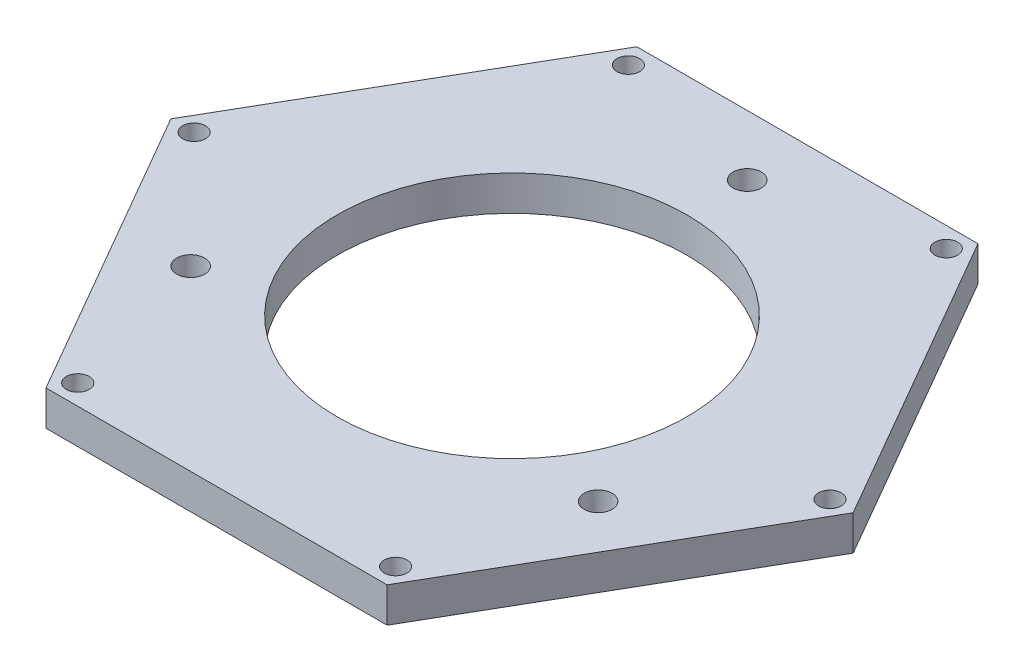
ISO-10303-21;
HEADER;
FILE_DESCRIPTION(('STEP AP214'),'2;1');
FILE_NAME('part.step','',(''),(''),'','','');
FILE_SCHEMA(('AUTOMOTIVE_DESIGN { 1 0 10303 214 1 1 1 1 }'));
ENDSEC;
DATA;
#1=APPLICATION_CONTEXT('core data for automotive mechanical design processes');
#2=APPLICATION_PROTOCOL_DEFINITION('international standard','automotive_design',2000,#1);
#3=PRODUCT_CONTEXT('',#1,'mechanical');
#4=PRODUCT('Part','Part','',(#3));
#5=PRODUCT_RELATED_PRODUCT_CATEGORY('part','',(#4));
#6=PRODUCT_DEFINITION_FORMATION('','',#4);
#7=PRODUCT_DEFINITION_CONTEXT('part definition',#1,'design');
#8=PRODUCT_DEFINITION('design','',#6,#7);
#9=PRODUCT_DEFINITION_SHAPE('','',#8);
#10=(LENGTH_UNIT() NAMED_UNIT(*) SI_UNIT(.MILLI.,.METRE.));
#11=(NAMED_UNIT(*) PLANE_ANGLE_UNIT() SI_UNIT($,.RADIAN.));
#12=(NAMED_UNIT(*) SI_UNIT($,.STERADIAN.) SOLID_ANGLE_UNIT());
#13=UNCERTAINTY_MEASURE_WITH_UNIT(LENGTH_MEASURE(1.E-05),#10,'distance_accuracy_value','');
#14=(GEOMETRIC_REPRESENTATION_CONTEXT(3) GLOBAL_UNCERTAINTY_ASSIGNED_CONTEXT((#13)) GLOBAL_UNIT_ASSIGNED_CONTEXT((#10,
#11,#12)) REPRESENTATION_CONTEXT('',''));
#15=CARTESIAN_POINT('',(0.,0.,0.));
#16=DIRECTION('',(0.,0.,1.));
#17=DIRECTION('',(1.,0.,0.));
#18=AXIS2_PLACEMENT_3D('',#15,#16,#17);
#19=CARTESIAN_POINT('',(21.072650536209,-4.,-40.6262044560889));
#20=DIRECTION('',(0.866025403784442,0.,-0.499999999999995));
#21=DIRECTION('',(-0.499999999999995,0.,-0.866025403784442));
#22=AXIS2_PLACEMENT_3D('',#19,#20,#21);
#23=PLANE('',#22);
#24=DIRECTION('',(-0.499999999999995,0.,-0.866025403784441));
#25=VECTOR('',#24,1.);
#26=CARTESIAN_POINT('',(21.072650536209,0.,-40.6262044560889));
#27=LINE('',#26,#25);
#28=CARTESIAN_POINT('',(21.072650536209,0.,-40.6262044560889));
#29=VERTEX_POINT('',#28);
#30=CARTESIAN_POINT('',(1.57265053620972,0.,-74.4011952036812));
#31=VERTEX_POINT('',#30);
#32=EDGE_CURVE('E118',#29,#31,#27,.T.);
#33=ORIENTED_EDGE('',*,*,#32,.F.);
#34=DIRECTION('',(0.,1.,0.));
#35=VECTOR('',#34,1.);
#36=CARTESIAN_POINT('',(21.072650536209,-4.,-40.6262044560889));
#37=LINE('',#36,#35);
#38=CARTESIAN_POINT('',(21.072650536209,-4.,-40.6262044560889));
#39=VERTEX_POINT('',#38);
#40=EDGE_CURVE('E11',#39,#29,#37,.T.);
#41=ORIENTED_EDGE('',*,*,#40,.F.);
#42=DIRECTION('',(-0.499999999999995,0.,-0.866025403784441));
#43=VECTOR('',#42,1.);
#44=CARTESIAN_POINT('',(21.072650536209,-4.,-40.6262044560889));
#45=LINE('',#44,#43);
#46=CARTESIAN_POINT('',(1.57265053620972,-4.,-74.4011952036812));
#47=VERTEX_POINT('',#46);
#48=EDGE_CURVE('E133',#39,#47,#45,.T.);
#49=ORIENTED_EDGE('',*,*,#48,.T.);
#50=DIRECTION('',(0.,1.,0.));
#51=VECTOR('',#50,1.);
#52=CARTESIAN_POINT('',(1.57265053620972,-4.,-74.4011952036812));
#53=LINE('',#52,#51);
#54=EDGE_CURVE('E36',#47,#31,#53,.T.);
#55=ORIENTED_EDGE('',*,*,#54,.T.);
#56=EDGE_LOOP('',(#33,#41,#49,#55));
#57=FACE_BOUND('',#56,.T.);
#58=ADVANCED_FACE('F33',(#57),#23,.T.);
#59=CARTESIAN_POINT('',(1.57265053620948,-4.,-6.85121370849522));
#60=DIRECTION('',(0.866025403784448,0.,0.499999999999984));
#61=DIRECTION('',(0.499999999999984,0.,-0.866025403784448));
#62=AXIS2_PLACEMENT_3D('',#59,#60,#61);
#63=PLANE('',#62);
#64=DIRECTION('',(0.499999999999984,0.,-0.866025403784448));
#65=VECTOR('',#64,1.);
#66=CARTESIAN_POINT('',(1.57265053620948,0.,-6.85121370849522));
#67=LINE('',#66,#65);
#68=CARTESIAN_POINT('',(1.57265053620948,0.,-6.85121370849522));
#69=VERTEX_POINT('',#68);
#70=EDGE_CURVE('E131',#69,#29,#67,.T.);
#71=ORIENTED_EDGE('',*,*,#70,.F.);
#72=DIRECTION('',(0.,1.,0.));
#73=VECTOR('',#72,1.);
#74=CARTESIAN_POINT('',(1.57265053620948,-4.,-6.85121370849522));
#75=LINE('',#74,#73);
#76=CARTESIAN_POINT('',(1.57265053620948,-4.,-6.85121370849522));
#77=VERTEX_POINT('',#76);
#78=EDGE_CURVE('E42',#77,#69,#75,.T.);
#79=ORIENTED_EDGE('',*,*,#78,.F.);
#80=DIRECTION('',(0.499999999999984,0.,-0.866025403784448));
#81=VECTOR('',#80,1.);
#82=CARTESIAN_POINT('',(1.57265053620948,-4.,-6.85121370849522));
#83=LINE('',#82,#81);
#84=EDGE_CURVE('E108',#77,#39,#83,.T.);
#85=ORIENTED_EDGE('',*,*,#84,.T.);
#86=ORIENTED_EDGE('',*,*,#40,.T.);
#87=EDGE_LOOP('',(#71,#79,#85,#86));
#88=FACE_BOUND('',#87,.T.);
#89=ADVANCED_FACE('F141',(#88),#63,.T.);
#90=CARTESIAN_POINT('',(-37.4273494637903,-4.,-6.85121370849512));
#91=DIRECTION('',(0.,0.,1.));
#92=DIRECTION('',(1.,0.,0.));
#93=AXIS2_PLACEMENT_3D('',#90,#91,#92);
#94=PLANE('',#93);
#95=DIRECTION('',(1.,0.,0.));
#96=VECTOR('',#95,1.);
#97=CARTESIAN_POINT('',(-37.4273494637903,0.,-6.85121370849512));
#98=LINE('',#97,#96);
#99=CARTESIAN_POINT('',(-37.4273494637903,0.,-6.85121370849512));
#100=VERTEX_POINT('',#99);
#101=EDGE_CURVE('E95',#100,#69,#98,.T.);
#102=ORIENTED_EDGE('',*,*,#101,.F.);
#103=DIRECTION('',(0.,1.,0.));
#104=VECTOR('',#103,1.);
#105=CARTESIAN_POINT('',(-37.4273494637903,-4.,-6.85121370849512));
#106=LINE('',#105,#104);
#107=CARTESIAN_POINT('',(-37.4273494637903,-4.,-6.85121370849512));
#108=VERTEX_POINT('',#107);
#109=EDGE_CURVE('E90',#108,#100,#106,.T.);
#110=ORIENTED_EDGE('',*,*,#109,.F.);
#111=DIRECTION('',(1.,0.,0.));
#112=VECTOR('',#111,1.);
#113=CARTESIAN_POINT('',(-37.4273494637903,-4.,-6.85121370849512));
#114=LINE('',#113,#112);
#115=EDGE_CURVE('E93',#108,#77,#114,.T.);
#116=ORIENTED_EDGE('',*,*,#115,.T.);
#117=ORIENTED_EDGE('',*,*,#78,.T.);
#118=EDGE_LOOP('',(#102,#110,#116,#117));
#119=FACE_BOUND('',#118,.T.);
#120=ADVANCED_FACE('F92',(#119),#94,.T.);
#121=CARTESIAN_POINT('',(-56.9273494637903,-4.,-40.6262044560881));
#122=DIRECTION('',(-0.866025403784438,0.,0.500000000000002));
#123=DIRECTION('',(0.500000000000002,0.,0.866025403784438));
#124=AXIS2_PLACEMENT_3D('',#121,#122,#123);
#125=PLANE('',#124);
#126=DIRECTION('',(0.500000000000002,0.,0.866025403784438));
#127=VECTOR('',#126,1.);
#128=CARTESIAN_POINT('',(-56.9273494637903,0.,-40.6262044560881));
#129=LINE('',#128,#127);
#130=CARTESIAN_POINT('',(-56.9273494637903,0.,-40.6262044560881));
#131=VERTEX_POINT('',#130);
#132=EDGE_CURVE('E128',#131,#100,#129,.T.);
#133=ORIENTED_EDGE('',*,*,#132,.F.);
#134=DIRECTION('',(0.,1.,0.));
#135=VECTOR('',#134,1.);
#136=CARTESIAN_POINT('',(-56.9273494637903,-4.,-40.6262044560881));
#137=LINE('',#136,#135);
#138=CARTESIAN_POINT('',(-56.9273494637903,-4.,-40.6262044560881));
#139=VERTEX_POINT('',#138);
#140=EDGE_CURVE('E100',#139,#131,#137,.T.);
#141=ORIENTED_EDGE('',*,*,#140,.F.);
#142=DIRECTION('',(0.500000000000002,0.,0.866025403784438));
#143=VECTOR('',#142,1.);
#144=CARTESIAN_POINT('',(-56.9273494637903,-4.,-40.6262044560881));
#145=LINE('',#144,#143);
#146=EDGE_CURVE('E106',#139,#108,#145,.T.);
#147=ORIENTED_EDGE('',*,*,#146,.T.);
#148=ORIENTED_EDGE('',*,*,#109,.T.);
#149=EDGE_LOOP('',(#133,#141,#147,#148));
#150=FACE_BOUND('',#149,.T.);
#151=ADVANCED_FACE('F110',(#150),#125,.T.);
#152=CARTESIAN_POINT('',(-37.4273494637903,-4.,-74.4011952036812));
#153=DIRECTION('',(-0.866025403784438,0.,-0.5));
#154=DIRECTION('',(-0.5,0.,0.866025403784439));
#155=AXIS2_PLACEMENT_3D('',#152,#153,#154);
#156=PLANE('',#155);
#157=DIRECTION('',(-0.5,0.,0.866025403784439));
#158=VECTOR('',#157,1.);
#159=CARTESIAN_POINT('',(-37.4273494637903,0.,-74.4011952036812));
#160=LINE('',#159,#158);
#161=CARTESIAN_POINT('',(-37.4273494637903,0.,-74.4011952036812));
#162=VERTEX_POINT('',#161);
#163=EDGE_CURVE('E125',#162,#131,#160,.T.);
#164=ORIENTED_EDGE('',*,*,#163,.F.);
#165=DIRECTION('',(0.,1.,0.));
#166=VECTOR('',#165,1.);
#167=CARTESIAN_POINT('',(-37.4273494637903,-4.,-74.4011952036812));
#168=LINE('',#167,#166);
#169=CARTESIAN_POINT('',(-37.4273494637903,-4.,-74.4011952036812));
#170=VERTEX_POINT('',#169);
#171=EDGE_CURVE('E136',#170,#162,#168,.T.);
#172=ORIENTED_EDGE('',*,*,#171,.F.);
#173=DIRECTION('',(-0.5,0.,0.866025403784439));
#174=VECTOR('',#173,1.);
#175=CARTESIAN_POINT('',(-37.4273494637903,-4.,-74.4011952036812));
#176=LINE('',#175,#174);
#177=EDGE_CURVE('E111',#170,#139,#176,.T.);
#178=ORIENTED_EDGE('',*,*,#177,.T.);
#179=ORIENTED_EDGE('',*,*,#140,.T.);
#180=EDGE_LOOP('',(#164,#172,#178,#179));
#181=FACE_BOUND('',#180,.T.);
#182=ADVANCED_FACE('F154',(#181),#156,.T.);
#183=CARTESIAN_POINT('',(1.57265053620972,-4.,-74.4011952036812));
#184=DIRECTION('',(0.,0.,-1.));
#185=DIRECTION('',(-1.,0.,0.));
#186=AXIS2_PLACEMENT_3D('',#183,#184,#185);
#187=PLANE('',#186);
#188=DIRECTION('',(-1.,0.,0.));
#189=VECTOR('',#188,1.);
#190=CARTESIAN_POINT('',(1.57265053620972,0.,-74.4011952036812));
#191=LINE('',#190,#189);
#192=EDGE_CURVE('E121',#31,#162,#191,.T.);
#193=ORIENTED_EDGE('',*,*,#192,.F.);
#194=ORIENTED_EDGE('',*,*,#54,.F.);
#195=DIRECTION('',(-1.,0.,0.));
#196=VECTOR('',#195,1.);
#197=CARTESIAN_POINT('',(1.57265053620972,-4.,-74.4011952036812));
#198=LINE('',#197,#196);
#199=EDGE_CURVE('E113',#47,#170,#198,.T.);
#200=ORIENTED_EDGE('',*,*,#199,.T.);
#201=ORIENTED_EDGE('',*,*,#171,.T.);
#202=EDGE_LOOP('',(#193,#194,#200,#201));
#203=FACE_BOUND('',#202,.T.);
#204=ADVANCED_FACE('F138',(#203),#187,.T.);
#205=CARTESIAN_POINT('',(0.,-4.,0.));
#206=DIRECTION('',(0.,1.,0.));
#207=DIRECTION('',(0.,0.,1.));
#208=AXIS2_PLACEMENT_3D('',#205,#206,#207);
#209=PLANE('',#208);
#210=CARTESIAN_POINT('',(-36.0994438446541,-4.,-72.1011952036812));
#211=DIRECTION('',(0.,1.,0.));
#212=DIRECTION('',(0.,0.,1.));
#213=AXIS2_PLACEMENT_3D('',#210,#211,#212);
#214=CIRCLE('',#213,1.3);
#215=CARTESIAN_POINT('',(-36.0994438446541,-4.,-70.8011952036812));
#216=VERTEX_POINT('',#215);
#217=EDGE_CURVE('E212',#216,#216,#214,.T.);
#218=ORIENTED_EDGE('',*,*,#217,.T.);
#219=EDGE_LOOP('',(#218));
#220=FACE_BOUND('',#219,.T.);
#221=CARTESIAN_POINT('',(-17.9273654894295,-4.,-67.5161859512742));
#222=DIRECTION('',(0.,1.,0.));
#223=DIRECTION('',(0.,0.,1.));
#224=AXIS2_PLACEMENT_3D('',#221,#222,#223);
#225=CIRCLE('',#224,1.6);
#226=CARTESIAN_POINT('',(-17.9273654894295,-4.,-65.9161859512742));
#227=VERTEX_POINT('',#226);
#228=EDGE_CURVE('E220',#227,#227,#225,.T.);
#229=ORIENTED_EDGE('',*,*,#228,.T.);
#230=EDGE_LOOP('',(#229));
#231=FACE_BOUND('',#230,.T.);
#232=CARTESIAN_POINT('',(-41.2147645587345,-4.,-27.1811905774776));
#233=DIRECTION('',(0.,1.,0.));
#234=DIRECTION('',(0.,0.,1.));
#235=AXIS2_PLACEMENT_3D('',#232,#233,#234);
#236=CIRCLE('',#235,1.6);
#237=CARTESIAN_POINT('',(-41.2147645587345,-4.,-25.5811905774776));
#238=VERTEX_POINT('',#237);
#239=EDGE_CURVE('E226',#238,#238,#236,.T.);
#240=ORIENTED_EDGE('',*,*,#239,.T.);
#241=EDGE_LOOP('',(#240));
#242=FACE_BOUND('',#241,.T.);
#243=CARTESIAN_POINT('',(-54.271538225518,-4.,-40.6262044560881));
#244=DIRECTION('',(0.,1.,0.));
#245=DIRECTION('',(0.,0.,1.));
#246=AXIS2_PLACEMENT_3D('',#243,#244,#245);
#247=CIRCLE('',#246,1.3);
#248=CARTESIAN_POINT('',(-54.271538225518,-4.,-39.3262044560881));
#249=VERTEX_POINT('',#248);
#250=EDGE_CURVE('E232',#249,#249,#247,.T.);
#251=ORIENTED_EDGE('',*,*,#250,.T.);
#252=EDGE_LOOP('',(#251));
#253=FACE_BOUND('',#252,.T.);
#254=CARTESIAN_POINT('',(0.24474491707331,-4.,-72.1011952036812));
#255=DIRECTION('',(0.,1.,0.));
#256=DIRECTION('',(0.,0.,1.));
#257=AXIS2_PLACEMENT_3D('',#254,#255,#256);
#258=CIRCLE('',#257,1.3);
#259=CARTESIAN_POINT('',(0.24474491707331,-4.,-70.8011952036812));
#260=VERTEX_POINT('',#259);
#261=EDGE_CURVE('E238',#260,#260,#258,.T.);
#262=ORIENTED_EDGE('',*,*,#261,.T.);
#263=EDGE_LOOP('',(#262));
#264=FACE_BOUND('',#263,.T.);
#265=CARTESIAN_POINT('',(18.4168392979367,-4.,-40.6262044560889));
#266=DIRECTION('',(0.,1.,0.));
#267=DIRECTION('',(0.,0.,1.));
#268=AXIS2_PLACEMENT_3D('',#265,#266,#267);
#269=CIRCLE('',#268,1.3);
#270=CARTESIAN_POINT('',(18.4168392979367,-4.,-39.3262044560889));
#271=VERTEX_POINT('',#270);
#272=EDGE_CURVE('E244',#271,#271,#269,.T.);
#273=ORIENTED_EDGE('',*,*,#272,.T.);
#274=EDGE_LOOP('',(#273));
#275=FACE_BOUND('',#274,.T.);
#276=CARTESIAN_POINT('',(-36.0994438446542,-4.,-9.15121370849512));
#277=DIRECTION('',(0.,1.,0.));
#278=DIRECTION('',(0.,0.,1.));
#279=AXIS2_PLACEMENT_3D('',#276,#277,#278);
#280=CIRCLE('',#279,1.3);
#281=CARTESIAN_POINT('',(-36.0994438446542,-4.,-7.85121370849511));
#282=VERTEX_POINT('',#281);
#283=EDGE_CURVE('E250',#282,#282,#280,.T.);
#284=ORIENTED_EDGE('',*,*,#283,.T.);
#285=EDGE_LOOP('',(#284));
#286=FACE_BOUND('',#285,.T.);
#287=CARTESIAN_POINT('',(0.244744900907444,-4.,-9.15121368049511));
#288=DIRECTION('',(0.,1.,0.));
#289=DIRECTION('',(0.,0.,1.));
#290=AXIS2_PLACEMENT_3D('',#287,#288,#289);
#291=CIRCLE('',#290,1.3);
#292=CARTESIAN_POINT('',(0.244744900907444,-4.,-7.85121368049511));
#293=VERTEX_POINT('',#292);
#294=EDGE_CURVE('E256',#293,#293,#291,.T.);
#295=ORIENTED_EDGE('',*,*,#294,.T.);
#296=EDGE_LOOP('',(#295));
#297=FACE_BOUND('',#296,.T.);
#298=CARTESIAN_POINT('',(5.36006563115331,-4.,-27.181209082292));
#299=DIRECTION('',(0.,1.,0.));
#300=DIRECTION('',(0.,0.,1.));
#301=AXIS2_PLACEMENT_3D('',#298,#299,#300);
#302=CIRCLE('',#301,1.60000000000034);
#303=CARTESIAN_POINT('',(5.36006563115331,-4.,-25.5812090822916));
#304=VERTEX_POINT('',#303);
#305=EDGE_CURVE('E262',#304,#304,#302,.T.);
#306=ORIENTED_EDGE('',*,*,#305,.T.);
#307=EDGE_LOOP('',(#306));
#308=FACE_BOUND('',#307,.T.);
#309=CARTESIAN_POINT('',(-17.9273548056702,-4.,-40.6261952036812));
#310=DIRECTION('',(0.,1.,0.));
#311=DIRECTION('',(0.,0.,1.));
#312=AXIS2_PLACEMENT_3D('',#309,#310,#311);
#313=CIRCLE('',#312,20.);
#314=CARTESIAN_POINT('',(-17.9273548056702,-4.,-20.6261952036812));
#315=VERTEX_POINT('',#314);
#316=EDGE_CURVE('E122',#315,#315,#313,.T.);
#317=ORIENTED_EDGE('',*,*,#316,.T.);
#318=EDGE_LOOP('',(#317));
#319=FACE_BOUND('',#318,.T.);
#320=ORIENTED_EDGE('',*,*,#48,.F.);
#321=ORIENTED_EDGE('',*,*,#84,.F.);
#322=ORIENTED_EDGE('',*,*,#115,.F.);
#323=ORIENTED_EDGE('',*,*,#146,.F.);
#324=ORIENTED_EDGE('',*,*,#177,.F.);
#325=ORIENTED_EDGE('',*,*,#199,.F.);
#326=EDGE_LOOP('',(#320,#321,#322,#323,#324,#325));
#327=FACE_BOUND('',#326,.T.);
#328=ADVANCED_FACE('F104',(#220,#231,#242,#253,#264,#275,#286,#297,#308,#319,#327),#209,.F.);
#329=CARTESIAN_POINT('',(0.,0.,0.));
#330=DIRECTION('',(0.,1.,0.));
#331=DIRECTION('',(0.,0.,1.));
#332=AXIS2_PLACEMENT_3D('',#329,#330,#331);
#333=PLANE('',#332);
#334=CARTESIAN_POINT('',(-36.0994438446541,0.,-72.1011952036812));
#335=DIRECTION('',(0.,1.,0.));
#336=DIRECTION('',(0.,0.,1.));
#337=AXIS2_PLACEMENT_3D('',#334,#335,#336);
#338=CIRCLE('',#337,1.3);
#339=CARTESIAN_POINT('',(-36.0994438446541,0.,-70.8011952036812));
#340=VERTEX_POINT('',#339);
#341=EDGE_CURVE('E215',#340,#340,#338,.T.);
#342=ORIENTED_EDGE('',*,*,#341,.F.);
#343=EDGE_LOOP('',(#342));
#344=FACE_BOUND('',#343,.T.);
#345=CARTESIAN_POINT('',(-17.9273654894295,0.,-67.5161859512742));
#346=DIRECTION('',(0.,1.,0.));
#347=DIRECTION('',(0.,0.,1.));
#348=AXIS2_PLACEMENT_3D('',#345,#346,#347);
#349=CIRCLE('',#348,1.6);
#350=CARTESIAN_POINT('',(-17.9273654894295,0.,-65.9161859512742));
#351=VERTEX_POINT('',#350);
#352=EDGE_CURVE('E217',#351,#351,#349,.T.);
#353=ORIENTED_EDGE('',*,*,#352,.F.);
#354=EDGE_LOOP('',(#353));
#355=FACE_BOUND('',#354,.T.);
#356=CARTESIAN_POINT('',(-41.2147645587345,0.,-27.1811905774776));
#357=DIRECTION('',(0.,1.,0.));
#358=DIRECTION('',(0.,0.,1.));
#359=AXIS2_PLACEMENT_3D('',#356,#357,#358);
#360=CIRCLE('',#359,1.6);
#361=CARTESIAN_POINT('',(-41.2147645587345,0.,-25.5811905774776));
#362=VERTEX_POINT('',#361);
#363=EDGE_CURVE('E223',#362,#362,#360,.T.);
#364=ORIENTED_EDGE('',*,*,#363,.F.);
#365=EDGE_LOOP('',(#364));
#366=FACE_BOUND('',#365,.T.);
#367=CARTESIAN_POINT('',(-54.271538225518,0.,-40.6262044560881));
#368=DIRECTION('',(0.,1.,0.));
#369=DIRECTION('',(0.,0.,1.));
#370=AXIS2_PLACEMENT_3D('',#367,#368,#369);
#371=CIRCLE('',#370,1.3);
#372=CARTESIAN_POINT('',(-54.271538225518,0.,-39.3262044560881));
#373=VERTEX_POINT('',#372);
#374=EDGE_CURVE('E229',#373,#373,#371,.T.);
#375=ORIENTED_EDGE('',*,*,#374,.F.);
#376=EDGE_LOOP('',(#375));
#377=FACE_BOUND('',#376,.T.);
#378=CARTESIAN_POINT('',(0.24474491707331,0.,-72.1011952036812));
#379=DIRECTION('',(0.,1.,0.));
#380=DIRECTION('',(0.,0.,1.));
#381=AXIS2_PLACEMENT_3D('',#378,#379,#380);
#382=CIRCLE('',#381,1.3);
#383=CARTESIAN_POINT('',(0.24474491707331,0.,-70.8011952036812));
#384=VERTEX_POINT('',#383);
#385=EDGE_CURVE('E235',#384,#384,#382,.T.);
#386=ORIENTED_EDGE('',*,*,#385,.F.);
#387=EDGE_LOOP('',(#386));
#388=FACE_BOUND('',#387,.T.);
#389=CARTESIAN_POINT('',(18.4168392979367,0.,-40.6262044560889));
#390=DIRECTION('',(0.,1.,0.));
#391=DIRECTION('',(0.,0.,1.));
#392=AXIS2_PLACEMENT_3D('',#389,#390,#391);
#393=CIRCLE('',#392,1.3);
#394=CARTESIAN_POINT('',(18.4168392979367,0.,-39.3262044560889));
#395=VERTEX_POINT('',#394);
#396=EDGE_CURVE('E241',#395,#395,#393,.T.);
#397=ORIENTED_EDGE('',*,*,#396,.F.);
#398=EDGE_LOOP('',(#397));
#399=FACE_BOUND('',#398,.T.);
#400=CARTESIAN_POINT('',(-36.0994438446542,0.,-9.15121370849512));
#401=DIRECTION('',(0.,1.,0.));
#402=DIRECTION('',(0.,0.,1.));
#403=AXIS2_PLACEMENT_3D('',#400,#401,#402);
#404=CIRCLE('',#403,1.3);
#405=CARTESIAN_POINT('',(-36.0994438446542,0.,-7.85121370849511));
#406=VERTEX_POINT('',#405);
#407=EDGE_CURVE('E247',#406,#406,#404,.T.);
#408=ORIENTED_EDGE('',*,*,#407,.F.);
#409=EDGE_LOOP('',(#408));
#410=FACE_BOUND('',#409,.T.);
#411=CARTESIAN_POINT('',(0.244744900907444,0.,-9.15121368049511));
#412=DIRECTION('',(0.,1.,0.));
#413=DIRECTION('',(0.,0.,1.));
#414=AXIS2_PLACEMENT_3D('',#411,#412,#413);
#415=CIRCLE('',#414,1.3);
#416=CARTESIAN_POINT('',(0.244744900907444,0.,-7.85121368049511));
#417=VERTEX_POINT('',#416);
#418=EDGE_CURVE('E253',#417,#417,#415,.T.);
#419=ORIENTED_EDGE('',*,*,#418,.F.);
#420=EDGE_LOOP('',(#419));
#421=FACE_BOUND('',#420,.T.);
#422=CARTESIAN_POINT('',(5.36006563115331,0.,-27.181209082292));
#423=DIRECTION('',(0.,1.,0.));
#424=DIRECTION('',(0.,0.,1.));
#425=AXIS2_PLACEMENT_3D('',#422,#423,#424);
#426=CIRCLE('',#425,1.60000000000034);
#427=CARTESIAN_POINT('',(5.36006563115331,0.,-25.5812090822916));
#428=VERTEX_POINT('',#427);
#429=EDGE_CURVE('E259',#428,#428,#426,.T.);
#430=ORIENTED_EDGE('',*,*,#429,.F.);
#431=EDGE_LOOP('',(#430));
#432=FACE_BOUND('',#431,.T.);
#433=CARTESIAN_POINT('',(-17.9273548056702,0.,-40.6261952036812));
#434=DIRECTION('',(0.,1.,0.));
#435=DIRECTION('',(0.,0.,1.));
#436=AXIS2_PLACEMENT_3D('',#433,#434,#435);
#437=CIRCLE('',#436,20.);
#438=CARTESIAN_POINT('',(-17.9273548056702,0.,-20.6261952036812));
#439=VERTEX_POINT('',#438);
#440=EDGE_CURVE('E265',#439,#439,#437,.T.);
#441=ORIENTED_EDGE('',*,*,#440,.F.);
#442=EDGE_LOOP('',(#441));
#443=FACE_BOUND('',#442,.T.);
#444=ORIENTED_EDGE('',*,*,#32,.T.);
#445=ORIENTED_EDGE('',*,*,#192,.T.);
#446=ORIENTED_EDGE('',*,*,#163,.T.);
#447=ORIENTED_EDGE('',*,*,#132,.T.);
#448=ORIENTED_EDGE('',*,*,#101,.T.);
#449=ORIENTED_EDGE('',*,*,#70,.T.);
#450=EDGE_LOOP('',(#444,#445,#446,#447,#448,#449));
#451=FACE_BOUND('',#450,.T.);
#452=ADVANCED_FACE('F140',(#344,#355,#366,#377,#388,#399,#410,#421,#432,#443,#451),#333,.T.);
#453=CARTESIAN_POINT('',(-17.9273548056702,-4.,-40.6261952036812));
#454=DIRECTION('',(0.,1.,0.));
#455=DIRECTION('',(0.,0.,1.));
#456=AXIS2_PLACEMENT_3D('',#453,#454,#455);
#457=CYLINDRICAL_SURFACE('',#456,20.);
#458=ORIENTED_EDGE('',*,*,#316,.F.);
#459=EDGE_LOOP('',(#458));
#460=FACE_BOUND('',#459,.T.);
#461=ORIENTED_EDGE('',*,*,#440,.T.);
#462=EDGE_LOOP('',(#461));
#463=FACE_BOUND('',#462,.T.);
#464=ADVANCED_FACE('F165',(#460,#463),#457,.F.);
#465=CARTESIAN_POINT('',(5.36006563115331,-4.,-27.181209082292));
#466=DIRECTION('',(0.,1.,0.));
#467=DIRECTION('',(0.,0.,1.));
#468=AXIS2_PLACEMENT_3D('',#465,#466,#467);
#469=CYLINDRICAL_SURFACE('',#468,1.60000000000034);
#470=ORIENTED_EDGE('',*,*,#305,.F.);
#471=EDGE_LOOP('',(#470));
#472=FACE_BOUND('',#471,.T.);
#473=ORIENTED_EDGE('',*,*,#429,.T.);
#474=EDGE_LOOP('',(#473));
#475=FACE_BOUND('',#474,.T.);
#476=ADVANCED_FACE('F172',(#472,#475),#469,.F.);
#477=CARTESIAN_POINT('',(0.244744900907444,-4.,-9.15121368049511));
#478=DIRECTION('',(0.,1.,0.));
#479=DIRECTION('',(0.,0.,1.));
#480=AXIS2_PLACEMENT_3D('',#477,#478,#479);
#481=CYLINDRICAL_SURFACE('',#480,1.3);
#482=ORIENTED_EDGE('',*,*,#294,.F.);
#483=EDGE_LOOP('',(#482));
#484=FACE_BOUND('',#483,.T.);
#485=ORIENTED_EDGE('',*,*,#418,.T.);
#486=EDGE_LOOP('',(#485));
#487=FACE_BOUND('',#486,.T.);
#488=ADVANCED_FACE('F176',(#484,#487),#481,.F.);
#489=CARTESIAN_POINT('',(-36.0994438446542,-4.,-9.15121370849512));
#490=DIRECTION('',(0.,1.,0.));
#491=DIRECTION('',(0.,0.,1.));
#492=AXIS2_PLACEMENT_3D('',#489,#490,#491);
#493=CYLINDRICAL_SURFACE('',#492,1.3);
#494=ORIENTED_EDGE('',*,*,#283,.F.);
#495=EDGE_LOOP('',(#494));
#496=FACE_BOUND('',#495,.T.);
#497=ORIENTED_EDGE('',*,*,#407,.T.);
#498=EDGE_LOOP('',(#497));
#499=FACE_BOUND('',#498,.T.);
#500=ADVANCED_FACE('F180',(#496,#499),#493,.F.);
#501=CARTESIAN_POINT('',(18.4168392979367,-4.,-40.6262044560889));
#502=DIRECTION('',(0.,1.,0.));
#503=DIRECTION('',(0.,0.,1.));
#504=AXIS2_PLACEMENT_3D('',#501,#502,#503);
#505=CYLINDRICAL_SURFACE('',#504,1.3);
#506=ORIENTED_EDGE('',*,*,#272,.F.);
#507=EDGE_LOOP('',(#506));
#508=FACE_BOUND('',#507,.T.);
#509=ORIENTED_EDGE('',*,*,#396,.T.);
#510=EDGE_LOOP('',(#509));
#511=FACE_BOUND('',#510,.T.);
#512=ADVANCED_FACE('F184',(#508,#511),#505,.F.);
#513=CARTESIAN_POINT('',(0.24474491707331,-4.,-72.1011952036812));
#514=DIRECTION('',(0.,1.,0.));
#515=DIRECTION('',(0.,0.,1.));
#516=AXIS2_PLACEMENT_3D('',#513,#514,#515);
#517=CYLINDRICAL_SURFACE('',#516,1.3);
#518=ORIENTED_EDGE('',*,*,#261,.F.);
#519=EDGE_LOOP('',(#518));
#520=FACE_BOUND('',#519,.T.);
#521=ORIENTED_EDGE('',*,*,#385,.T.);
#522=EDGE_LOOP('',(#521));
#523=FACE_BOUND('',#522,.T.);
#524=ADVANCED_FACE('F188',(#520,#523),#517,.F.);
#525=CARTESIAN_POINT('',(-54.271538225518,-4.,-40.6262044560881));
#526=DIRECTION('',(0.,1.,0.));
#527=DIRECTION('',(0.,0.,1.));
#528=AXIS2_PLACEMENT_3D('',#525,#526,#527);
#529=CYLINDRICAL_SURFACE('',#528,1.3);
#530=ORIENTED_EDGE('',*,*,#250,.F.);
#531=EDGE_LOOP('',(#530));
#532=FACE_BOUND('',#531,.T.);
#533=ORIENTED_EDGE('',*,*,#374,.T.);
#534=EDGE_LOOP('',(#533));
#535=FACE_BOUND('',#534,.T.);
#536=ADVANCED_FACE('F192',(#532,#535),#529,.F.);
#537=CARTESIAN_POINT('',(-41.2147645587345,-4.,-27.1811905774776));
#538=DIRECTION('',(0.,1.,0.));
#539=DIRECTION('',(0.,0.,1.));
#540=AXIS2_PLACEMENT_3D('',#537,#538,#539);
#541=CYLINDRICAL_SURFACE('',#540,1.6);
#542=ORIENTED_EDGE('',*,*,#239,.F.);
#543=EDGE_LOOP('',(#542));
#544=FACE_BOUND('',#543,.T.);
#545=ORIENTED_EDGE('',*,*,#363,.T.);
#546=EDGE_LOOP('',(#545));
#547=FACE_BOUND('',#546,.T.);
#548=ADVANCED_FACE('F196',(#544,#547),#541,.F.);
#549=CARTESIAN_POINT('',(-17.9273654894295,-4.,-67.5161859512742));
#550=DIRECTION('',(0.,1.,0.));
#551=DIRECTION('',(0.,0.,1.));
#552=AXIS2_PLACEMENT_3D('',#549,#550,#551);
#553=CYLINDRICAL_SURFACE('',#552,1.6);
#554=ORIENTED_EDGE('',*,*,#228,.F.);
#555=EDGE_LOOP('',(#554));
#556=FACE_BOUND('',#555,.T.);
#557=ORIENTED_EDGE('',*,*,#352,.T.);
#558=EDGE_LOOP('',(#557));
#559=FACE_BOUND('',#558,.T.);
#560=ADVANCED_FACE('F200',(#556,#559),#553,.F.);
#561=CARTESIAN_POINT('',(-36.0994438446541,-4.,-72.1011952036812));
#562=DIRECTION('',(0.,1.,0.));
#563=DIRECTION('',(0.,0.,1.));
#564=AXIS2_PLACEMENT_3D('',#561,#562,#563);
#565=CYLINDRICAL_SURFACE('',#564,1.3);
#566=ORIENTED_EDGE('',*,*,#217,.F.);
#567=EDGE_LOOP('',(#566));
#568=FACE_BOUND('',#567,.T.);
#569=ORIENTED_EDGE('',*,*,#341,.T.);
#570=EDGE_LOOP('',(#569));
#571=FACE_BOUND('',#570,.T.);
#572=ADVANCED_FACE('F204',(#568,#571),#565,.F.);
#573=CLOSED_SHELL('',(#58,#89,#120,#151,#182,#204,#328,#452,#464,#476,#488,#500,#512,#524,#536,
#548,#560,#572));
#574=MANIFOLD_SOLID_BREP('B2',#573);
#575=ADVANCED_BREP_SHAPE_REPRESENTATION('',(#18,#574),#14);
#576=SHAPE_DEFINITION_REPRESENTATION(#9,#575);
ENDSEC;
END-ISO-10303-21;
